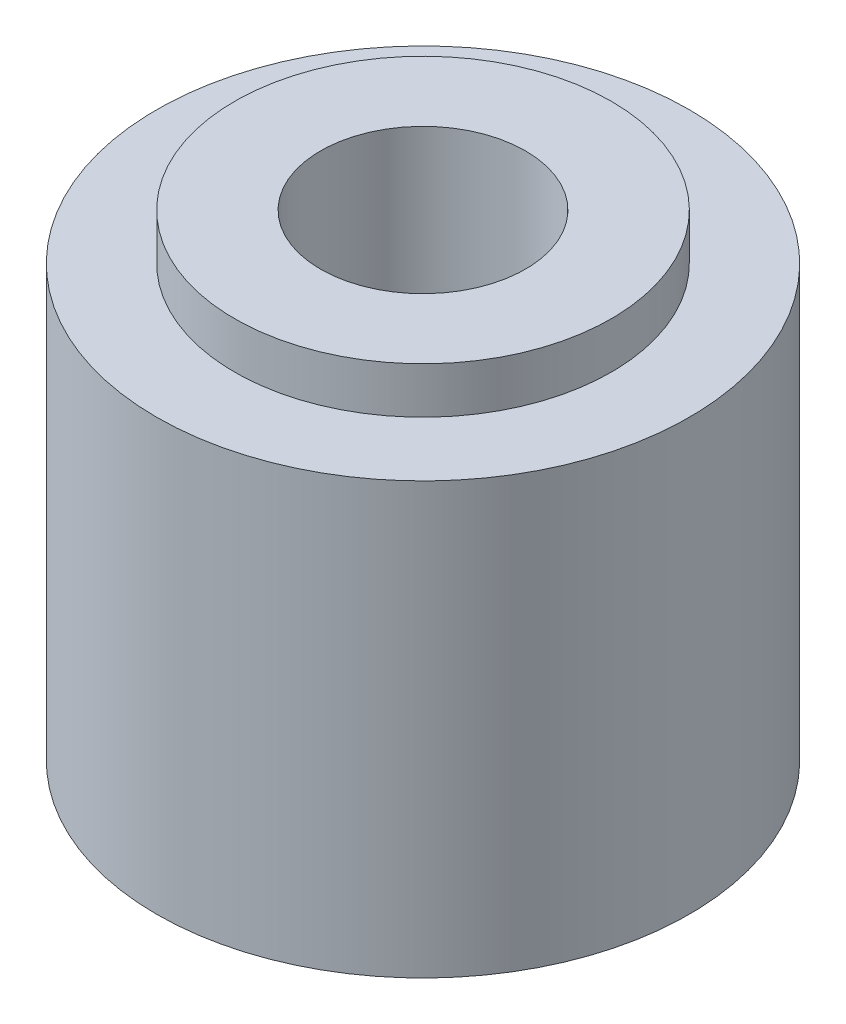
ISO-10303-21;
HEADER;
FILE_DESCRIPTION(('STEP AP214'),'2;1');
FILE_NAME('part.step','',(''),(''),'','','');
FILE_SCHEMA(('AUTOMOTIVE_DESIGN { 1 0 10303 214 1 1 1 1 }'));
ENDSEC;
DATA;
#1=APPLICATION_CONTEXT('core data for automotive mechanical design processes');
#2=APPLICATION_PROTOCOL_DEFINITION('international standard','automotive_design',2000,#1);
#3=PRODUCT_CONTEXT('',#1,'mechanical');
#4=PRODUCT('Part','Part','',(#3));
#5=PRODUCT_RELATED_PRODUCT_CATEGORY('part','',(#4));
#6=PRODUCT_DEFINITION_FORMATION('','',#4);
#7=PRODUCT_DEFINITION_CONTEXT('part definition',#1,'design');
#8=PRODUCT_DEFINITION('design','',#6,#7);
#9=PRODUCT_DEFINITION_SHAPE('','',#8);
#10=(LENGTH_UNIT() NAMED_UNIT(*) SI_UNIT(.MILLI.,.METRE.));
#11=(NAMED_UNIT(*) PLANE_ANGLE_UNIT() SI_UNIT($,.RADIAN.));
#12=(NAMED_UNIT(*) SI_UNIT($,.STERADIAN.) SOLID_ANGLE_UNIT());
#13=UNCERTAINTY_MEASURE_WITH_UNIT(LENGTH_MEASURE(1.E-05),#10,'distance_accuracy_value','');
#14=(GEOMETRIC_REPRESENTATION_CONTEXT(3) GLOBAL_UNCERTAINTY_ASSIGNED_CONTEXT((#13)) GLOBAL_UNIT_ASSIGNED_CONTEXT((#10,
#11,#12)) REPRESENTATION_CONTEXT('',''));
#15=CARTESIAN_POINT('',(0.,0.,0.));
#16=DIRECTION('',(0.,0.,1.));
#17=DIRECTION('',(1.,0.,0.));
#18=AXIS2_PLACEMENT_3D('',#15,#16,#17);
#19=CARTESIAN_POINT('',(0.,80.,0.));
#20=DIRECTION('',(0.,1.,0.));
#21=DIRECTION('',(0.,0.,1.));
#22=AXIS2_PLACEMENT_3D('',#19,#20,#21);
#23=PLANE('',#22);
#24=CARTESIAN_POINT('',(0.,80.,0.));
#25=DIRECTION('',(0.,1.,0.));
#26=DIRECTION('',(0.,0.,1.));
#27=AXIS2_PLACEMENT_3D('',#24,#25,#26);
#28=CIRCLE('',#27,49.5);
#29=CARTESIAN_POINT('',(0.,80.,49.5));
#30=VERTEX_POINT('',#29);
#31=EDGE_CURVE('E10',#30,#30,#28,.T.);
#32=ORIENTED_EDGE('',*,*,#31,.T.);
#33=EDGE_LOOP('',(#32));
#34=FACE_BOUND('',#33,.T.);
#35=CARTESIAN_POINT('',(0.,80.,0.));
#36=DIRECTION('',(0.,1.,0.));
#37=DIRECTION('',(0.,0.,1.));
#38=AXIS2_PLACEMENT_3D('',#35,#36,#37);
#39=CIRCLE('',#38,35.);
#40=CARTESIAN_POINT('',(0.,80.,-35.));
#41=VERTEX_POINT('',#40);
#42=EDGE_CURVE('E56',#41,#41,#39,.T.);
#43=ORIENTED_EDGE('',*,*,#42,.F.);
#44=EDGE_LOOP('',(#43));
#45=FACE_BOUND('',#44,.T.);
#46=ADVANCED_FACE('F37',(#34,#45),#23,.T.);
#47=CARTESIAN_POINT('',(0.,0.,0.));
#48=DIRECTION('',(0.,1.,0.));
#49=DIRECTION('',(0.,0.,1.));
#50=AXIS2_PLACEMENT_3D('',#47,#48,#49);
#51=PLANE('',#50);
#52=CARTESIAN_POINT('',(0.,0.,0.));
#53=DIRECTION('',(0.,1.,0.));
#54=DIRECTION('',(0.,0.,1.));
#55=AXIS2_PLACEMENT_3D('',#52,#53,#54);
#56=CIRCLE('',#55,49.5);
#57=CARTESIAN_POINT('',(0.,0.,49.5));
#58=VERTEX_POINT('',#57);
#59=EDGE_CURVE('E41',#58,#58,#56,.T.);
#60=ORIENTED_EDGE('',*,*,#59,.F.);
#61=EDGE_LOOP('',(#60));
#62=FACE_BOUND('',#61,.T.);
#63=CARTESIAN_POINT('',(0.,0.,0.));
#64=DIRECTION('',(0.,1.,0.));
#65=DIRECTION('',(0.,0.,1.));
#66=AXIS2_PLACEMENT_3D('',#63,#64,#65);
#67=CIRCLE('',#66,19.05);
#68=CARTESIAN_POINT('',(0.,0.,19.05));
#69=VERTEX_POINT('',#68);
#70=EDGE_CURVE('E50',#69,#69,#67,.T.);
#71=ORIENTED_EDGE('',*,*,#70,.T.);
#72=EDGE_LOOP('',(#71));
#73=FACE_BOUND('',#72,.T.);
#74=ADVANCED_FACE('F84',(#62,#73),#51,.F.);
#75=CARTESIAN_POINT('',(0.,80.,0.));
#76=DIRECTION('',(0.,-1.,0.));
#77=DIRECTION('',(0.,0.,-1.));
#78=AXIS2_PLACEMENT_3D('',#75,#76,#77);
#79=CYLINDRICAL_SURFACE('',#78,49.5);
#80=ORIENTED_EDGE('',*,*,#31,.F.);
#81=EDGE_LOOP('',(#80));
#82=FACE_BOUND('',#81,.T.);
#83=ORIENTED_EDGE('',*,*,#59,.T.);
#84=EDGE_LOOP('',(#83));
#85=FACE_BOUND('',#84,.T.);
#86=ADVANCED_FACE('F39',(#82,#85),#79,.T.);
#87=CARTESIAN_POINT('',(0.,80.,0.));
#88=DIRECTION('',(0.,-1.,0.));
#89=DIRECTION('',(0.,0.,-1.));
#90=AXIS2_PLACEMENT_3D('',#87,#88,#89);
#91=CYLINDRICAL_SURFACE('',#90,19.05);
#92=ORIENTED_EDGE('',*,*,#70,.F.);
#93=EDGE_LOOP('',(#92));
#94=FACE_BOUND('',#93,.T.);
#95=CARTESIAN_POINT('',(0.,88.6,0.));
#96=DIRECTION('',(0.,1.,0.));
#97=DIRECTION('',(0.,0.,1.));
#98=AXIS2_PLACEMENT_3D('',#95,#96,#97);
#99=CIRCLE('',#98,19.05);
#100=CARTESIAN_POINT('',(0.,88.6,19.05));
#101=VERTEX_POINT('',#100);
#102=EDGE_CURVE('E60',#101,#101,#99,.T.);
#103=ORIENTED_EDGE('',*,*,#102,.T.);
#104=EDGE_LOOP('',(#103));
#105=FACE_BOUND('',#104,.T.);
#106=ADVANCED_FACE('F68',(#94,#105),#91,.F.);
#107=CARTESIAN_POINT('',(0.,88.6,0.));
#108=DIRECTION('',(0.,1.,0.));
#109=DIRECTION('',(0.,0.,1.));
#110=AXIS2_PLACEMENT_3D('',#107,#108,#109);
#111=PLANE('',#110);
#112=CARTESIAN_POINT('',(0.,88.6,0.));
#113=DIRECTION('',(0.,1.,0.));
#114=DIRECTION('',(0.,0.,1.));
#115=AXIS2_PLACEMENT_3D('',#112,#113,#114);
#116=CIRCLE('',#115,35.);
#117=CARTESIAN_POINT('',(0.,88.6,-35.));
#118=VERTEX_POINT('',#117);
#119=EDGE_CURVE('E55',#118,#118,#116,.T.);
#120=ORIENTED_EDGE('',*,*,#119,.T.);
#121=EDGE_LOOP('',(#120));
#122=FACE_BOUND('',#121,.T.);
#123=ORIENTED_EDGE('',*,*,#102,.F.);
#124=EDGE_LOOP('',(#123));
#125=FACE_BOUND('',#124,.T.);
#126=ADVANCED_FACE('F70',(#122,#125),#111,.T.);
#127=CARTESIAN_POINT('',(0.,88.6,0.));
#128=DIRECTION('',(0.,-1.,0.));
#129=DIRECTION('',(0.,0.,-1.));
#130=AXIS2_PLACEMENT_3D('',#127,#128,#129);
#131=CYLINDRICAL_SURFACE('',#130,35.);
#132=CARTESIAN_POINT('',(0.,88.6,-35.));
#133=CARTESIAN_POINT('',(0.,88.5104166666666,-35.));
#134=CARTESIAN_POINT('',(0.,88.4208333333333,-35.));
#135=CARTESIAN_POINT('',(0.,88.2416666666666,-35.));
#136=CARTESIAN_POINT('',(0.,88.1520833333333,-35.));
#137=CARTESIAN_POINT('',(0.,87.9729166666666,-35.));
#138=CARTESIAN_POINT('',(0.,87.8833333333333,-35.));
#139=CARTESIAN_POINT('',(0.,87.7041666666667,-35.));
#140=CARTESIAN_POINT('',(0.,87.6145833333333,-35.));
#141=CARTESIAN_POINT('',(0.,87.4354166666667,-35.));
#142=CARTESIAN_POINT('',(0.,87.3458333333333,-35.));
#143=CARTESIAN_POINT('',(0.,87.1666666666667,-35.));
#144=CARTESIAN_POINT('',(0.,87.0770833333333,-35.));
#145=CARTESIAN_POINT('',(0.,86.8979166666667,-35.));
#146=CARTESIAN_POINT('',(0.,86.8083333333333,-35.));
#147=CARTESIAN_POINT('',(0.,86.6291666666667,-35.));
#148=CARTESIAN_POINT('',(0.,86.5395833333333,-35.));
#149=CARTESIAN_POINT('',(0.,86.3604166666667,-35.));
#150=CARTESIAN_POINT('',(0.,86.2708333333333,-35.));
#151=CARTESIAN_POINT('',(0.,86.0916666666667,-35.));
#152=CARTESIAN_POINT('',(0.,86.0020833333333,-35.));
#153=CARTESIAN_POINT('',(0.,85.8229166666667,-35.));
#154=CARTESIAN_POINT('',(0.,85.7333333333333,-35.));
#155=CARTESIAN_POINT('',(0.,85.5541666666667,-35.));
#156=CARTESIAN_POINT('',(0.,85.4645833333333,-35.));
#157=CARTESIAN_POINT('',(0.,85.2854166666666,-35.));
#158=CARTESIAN_POINT('',(0.,85.1958333333333,-35.));
#159=CARTESIAN_POINT('',(0.,85.0166666666667,-35.));
#160=CARTESIAN_POINT('',(0.,84.9270833333333,-35.));
#161=CARTESIAN_POINT('',(0.,84.7479166666667,-35.));
#162=CARTESIAN_POINT('',(0.,84.6583333333333,-35.));
#163=CARTESIAN_POINT('',(0.,84.4791666666667,-35.));
#164=CARTESIAN_POINT('',(0.,84.3895833333333,-35.));
#165=CARTESIAN_POINT('',(0.,84.2104166666667,-35.));
#166=CARTESIAN_POINT('',(0.,84.1208333333333,-35.));
#167=CARTESIAN_POINT('',(0.,83.9416666666666,-35.));
#168=CARTESIAN_POINT('',(0.,83.8520833333333,-35.));
#169=CARTESIAN_POINT('',(0.,83.6729166666667,-35.));
#170=CARTESIAN_POINT('',(0.,83.5833333333333,-35.));
#171=CARTESIAN_POINT('',(0.,83.4041666666667,-35.));
#172=CARTESIAN_POINT('',(0.,83.3145833333333,-35.));
#173=CARTESIAN_POINT('',(0.,83.1354166666667,-35.));
#174=CARTESIAN_POINT('',(0.,83.0458333333333,-35.));
#175=CARTESIAN_POINT('',(0.,82.8666666666667,-35.));
#176=CARTESIAN_POINT('',(0.,82.7770833333333,-35.));
#177=CARTESIAN_POINT('',(0.,82.5979166666667,-35.));
#178=CARTESIAN_POINT('',(0.,82.5083333333333,-35.));
#179=CARTESIAN_POINT('',(0.,82.3291666666667,-35.));
#180=CARTESIAN_POINT('',(0.,82.2395833333333,-35.));
#181=CARTESIAN_POINT('',(0.,82.0604166666667,-35.));
#182=CARTESIAN_POINT('',(0.,81.9708333333333,-35.));
#183=CARTESIAN_POINT('',(0.,81.7916666666667,-35.));
#184=CARTESIAN_POINT('',(0.,81.7020833333333,-35.));
#185=CARTESIAN_POINT('',(0.,81.5229166666667,-35.));
#186=CARTESIAN_POINT('',(0.,81.4333333333333,-35.));
#187=CARTESIAN_POINT('',(0.,81.2541666666666,-35.));
#188=CARTESIAN_POINT('',(0.,81.1645833333333,-35.));
#189=CARTESIAN_POINT('',(0.,80.9854166666667,-35.));
#190=CARTESIAN_POINT('',(0.,80.8958333333333,-35.));
#191=CARTESIAN_POINT('',(0.,80.7166666666667,-35.));
#192=CARTESIAN_POINT('',(0.,80.6270833333333,-35.));
#193=CARTESIAN_POINT('',(0.,80.4479166666667,-35.));
#194=CARTESIAN_POINT('',(0.,80.3583333333333,-35.));
#195=CARTESIAN_POINT('',(0.,80.1791666666667,-35.));
#196=CARTESIAN_POINT('',(0.,80.0895833333333,-35.));
#197=CARTESIAN_POINT('',(0.,80.,-35.));
#198=B_SPLINE_CURVE_WITH_KNOTS('',3,(#132,#133,#134,#135,#136,#137,#138,#139,#140,#141,#142,
#143,#144,#145,#146,#147,#148,#149,#150,#151,#152,#153,#154,#155,#156,#157,#158,#159,#160,#161,
#162,#163,#164,#165,#166,#167,#168,#169,#170,#171,#172,#173,#174,#175,#176,#177,#178,#179,#180,
#181,#182,#183,#184,#185,#186,#187,#188,#189,#190,#191,#192,#193,#194,#195,#196,#197),
.UNSPECIFIED.,.F.,.F.,(4,2,2,2,2,2,2,2,2,2,2,2,2,2,2,2,2,2,2,2,2,2,2,2,2,2,2,2,2,2,2,2,4),(0.,
0.268749999999998,0.537499999999996,0.806249999999994,1.07499999999999,1.34374999999999,
1.61249999999999,1.88124999999999,2.14999999999999,2.41875,2.6875,2.95624999999999,
3.22499999999999,3.49374999999999,3.76249999999999,4.03124999999999,4.29999999999998,4.56875,
4.8375,5.10624999999999,5.37499999999999,5.64374999999999,5.91249999999999,6.18124999999999,
6.44999999999998,6.71875,6.98749999999999,7.25624999999999,7.52499999999999,7.79374999999999,
8.06249999999999,8.33124999999998,8.59999999999998),.UNSPECIFIED.);
#199=EDGE_CURVE('BSEAM72',#118,#41,#198,.T.);
#200=ORIENTED_EDGE('',*,*,#119,.F.);
#201=ORIENTED_EDGE('',*,*,#42,.T.);
#202=ORIENTED_EDGE('',*,*,#199,.T.);
#203=ORIENTED_EDGE('',*,*,#199,.F.);
#204=EDGE_LOOP('',(#200,#202,#201,#203));
#205=FACE_BOUND('',#204,.T.);
#206=ADVANCED_FACE('F72',(#205),#131,.T.);
#207=CLOSED_SHELL('',(#46,#74,#86,#106,#126,#206));
#208=MANIFOLD_SOLID_BREP('B2',#207);
#209=ADVANCED_BREP_SHAPE_REPRESENTATION('',(#18,#208),#14);
#210=SHAPE_DEFINITION_REPRESENTATION(#9,#209);
ENDSEC;
END-ISO-10303-21;
